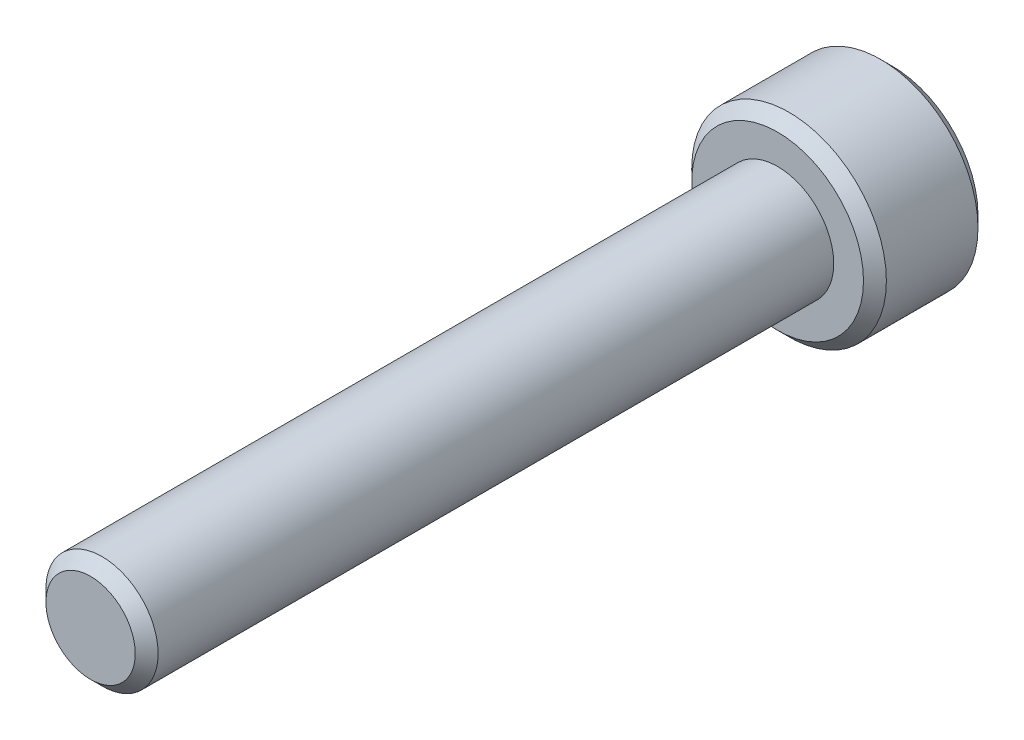
ISO-10303-21;
HEADER;
FILE_DESCRIPTION(('STEP AP214'),'2;1');
FILE_NAME('part.step','',(''),(''),'','','');
FILE_SCHEMA(('AUTOMOTIVE_DESIGN { 1 0 10303 214 1 1 1 1 }'));
ENDSEC;
DATA;
#1=APPLICATION_CONTEXT('core data for automotive mechanical design processes');
#2=APPLICATION_PROTOCOL_DEFINITION('international standard','automotive_design',2000,#1);
#3=PRODUCT_CONTEXT('',#1,'mechanical');
#4=PRODUCT('Part','Part','',(#3));
#5=PRODUCT_RELATED_PRODUCT_CATEGORY('part','',(#4));
#6=PRODUCT_DEFINITION_FORMATION('','',#4);
#7=PRODUCT_DEFINITION_CONTEXT('part definition',#1,'design');
#8=PRODUCT_DEFINITION('design','',#6,#7);
#9=PRODUCT_DEFINITION_SHAPE('','',#8);
#10=(LENGTH_UNIT() NAMED_UNIT(*) SI_UNIT(.MILLI.,.METRE.));
#11=(NAMED_UNIT(*) PLANE_ANGLE_UNIT() SI_UNIT($,.RADIAN.));
#12=(NAMED_UNIT(*) SI_UNIT($,.STERADIAN.) SOLID_ANGLE_UNIT());
#13=UNCERTAINTY_MEASURE_WITH_UNIT(LENGTH_MEASURE(1.E-05),#10,'distance_accuracy_value','');
#14=(GEOMETRIC_REPRESENTATION_CONTEXT(3) GLOBAL_UNCERTAINTY_ASSIGNED_CONTEXT((#13)) GLOBAL_UNIT_ASSIGNED_CONTEXT((#10,
#11,#12)) REPRESENTATION_CONTEXT('',''));
#15=CARTESIAN_POINT('',(0.,0.,0.));
#16=DIRECTION('',(0.,0.,1.));
#17=DIRECTION('',(1.,0.,0.));
#18=AXIS2_PLACEMENT_3D('',#15,#16,#17);
#19=CARTESIAN_POINT('',(0.,0.,5.));
#20=DIRECTION('',(0.,0.,-1.));
#21=DIRECTION('',(-1.,0.,0.));
#22=AXIS2_PLACEMENT_3D('',#19,#20,#21);
#23=CYLINDRICAL_SURFACE('',#22,4.25);
#24=CARTESIAN_POINT('',(0.,0.,0.500000000000003));
#25=DIRECTION('',(0.,0.,1.));
#26=DIRECTION('',(1.,0.,0.));
#27=AXIS2_PLACEMENT_3D('',#24,#25,#26);
#28=CIRCLE('',#27,4.25);
#29=CARTESIAN_POINT('',(4.25,0.,0.500000000000003));
#30=VERTEX_POINT('',#29);
#31=EDGE_CURVE('E64',#30,#30,#28,.T.);
#32=ORIENTED_EDGE('',*,*,#31,.T.);
#33=EDGE_LOOP('',(#32));
#34=FACE_BOUND('',#33,.T.);
#35=CARTESIAN_POINT('',(0.,0.,4.5));
#36=DIRECTION('',(0.,0.,1.));
#37=DIRECTION('',(1.,0.,0.));
#38=AXIS2_PLACEMENT_3D('',#35,#36,#37);
#39=CIRCLE('',#38,4.25);
#40=CARTESIAN_POINT('',(4.25,0.,4.5));
#41=VERTEX_POINT('',#40);
#42=EDGE_CURVE('E68',#41,#41,#39,.F.);
#43=ORIENTED_EDGE('',*,*,#42,.T.);
#44=EDGE_LOOP('',(#43));
#45=FACE_BOUND('',#44,.T.);
#46=ADVANCED_FACE('F38',(#34,#45),#23,.T.);
#47=CARTESIAN_POINT('',(0.,0.,5.));
#48=DIRECTION('',(0.,0.,1.));
#49=DIRECTION('',(1.,0.,0.));
#50=AXIS2_PLACEMENT_3D('',#47,#48,#49);
#51=PLANE('',#50);
#52=CARTESIAN_POINT('',(0.,0.,5.));
#53=DIRECTION('',(0.,0.,1.));
#54=DIRECTION('',(1.,0.,0.));
#55=AXIS2_PLACEMENT_3D('',#52,#53,#54);
#56=CIRCLE('',#55,3.75);
#57=CARTESIAN_POINT('',(3.75,0.,5.));
#58=VERTEX_POINT('',#57);
#59=EDGE_CURVE('E51',#58,#58,#56,.T.);
#60=ORIENTED_EDGE('',*,*,#59,.T.);
#61=EDGE_LOOP('',(#60));
#62=FACE_BOUND('',#61,.T.);
#63=CARTESIAN_POINT('',(0.,0.,5.));
#64=DIRECTION('',(0.,0.,1.));
#65=DIRECTION('',(1.,0.,0.));
#66=AXIS2_PLACEMENT_3D('',#63,#64,#65);
#67=CIRCLE('',#66,2.45);
#68=CARTESIAN_POINT('',(2.45,0.,5.));
#69=VERTEX_POINT('',#68);
#70=EDGE_CURVE('E71',#69,#69,#67,.F.);
#71=ORIENTED_EDGE('',*,*,#70,.T.);
#72=EDGE_LOOP('',(#71));
#73=FACE_BOUND('',#72,.T.);
#74=ADVANCED_FACE('F75',(#62,#73),#51,.T.);
#75=CARTESIAN_POINT('',(0.,0.,0.));
#76=DIRECTION('',(0.,0.,1.));
#77=DIRECTION('',(1.,0.,0.));
#78=AXIS2_PLACEMENT_3D('',#75,#76,#77);
#79=PLANE('',#78);
#80=CARTESIAN_POINT('',(0.,0.,0.));
#81=DIRECTION('',(0.,0.,1.));
#82=DIRECTION('',(1.,0.,0.));
#83=AXIS2_PLACEMENT_3D('',#80,#81,#82);
#84=CIRCLE('',#83,3.75);
#85=CARTESIAN_POINT('',(3.75,0.,0.));
#86=VERTEX_POINT('',#85);
#87=EDGE_CURVE('E58',#86,#86,#84,.F.);
#88=ORIENTED_EDGE('',*,*,#87,.T.);
#89=EDGE_LOOP('',(#88));
#90=FACE_BOUND('',#89,.T.);
#91=ADVANCED_FACE('F80',(#90),#79,.F.);
#92=CARTESIAN_POINT('',(0.,0.,35.));
#93=DIRECTION('',(0.,0.,-1.));
#94=DIRECTION('',(-1.,0.,0.));
#95=AXIS2_PLACEMENT_3D('',#92,#93,#94);
#96=CYLINDRICAL_SURFACE('',#95,2.45);
#97=CARTESIAN_POINT('',(0.,0.,34.5));
#98=DIRECTION('',(0.,0.,1.));
#99=DIRECTION('',(1.,0.,0.));
#100=AXIS2_PLACEMENT_3D('',#97,#98,#99);
#101=CIRCLE('',#100,2.45);
#102=CARTESIAN_POINT('',(2.45,0.,34.5));
#103=VERTEX_POINT('',#102);
#104=EDGE_CURVE('E10',#103,#103,#101,.F.);
#105=ORIENTED_EDGE('',*,*,#104,.T.);
#106=EDGE_LOOP('',(#105));
#107=FACE_BOUND('',#106,.T.);
#108=ORIENTED_EDGE('',*,*,#70,.F.);
#109=EDGE_LOOP('',(#108));
#110=FACE_BOUND('',#109,.T.);
#111=ADVANCED_FACE('F77',(#107,#110),#96,.T.);
#112=CARTESIAN_POINT('',(0.,0.,35.));
#113=DIRECTION('',(0.,0.,1.));
#114=DIRECTION('',(1.,0.,0.));
#115=AXIS2_PLACEMENT_3D('',#112,#113,#114);
#116=PLANE('',#115);
#117=CARTESIAN_POINT('',(0.,0.,35.));
#118=DIRECTION('',(0.,0.,1.));
#119=DIRECTION('',(1.,0.,0.));
#120=AXIS2_PLACEMENT_3D('',#117,#118,#119);
#121=CIRCLE('',#120,1.95);
#122=CARTESIAN_POINT('',(1.95,0.,35.));
#123=VERTEX_POINT('',#122);
#124=EDGE_CURVE('E46',#123,#123,#121,.T.);
#125=ORIENTED_EDGE('',*,*,#124,.T.);
#126=EDGE_LOOP('',(#125));
#127=FACE_BOUND('',#126,.T.);
#128=ADVANCED_FACE('F79',(#127),#116,.T.);
#129=CARTESIAN_POINT('',(0.,0.,0.500000000000003));
#130=DIRECTION('',(0.,0.,1.));
#131=DIRECTION('',(1.,0.,0.));
#132=AXIS2_PLACEMENT_3D('',#129,#130,#131);
#133=CONICAL_SURFACE('',#132,4.25,0.785398163397446);
#134=ORIENTED_EDGE('',*,*,#87,.F.);
#135=EDGE_LOOP('',(#134));
#136=FACE_BOUND('',#135,.T.);
#137=ORIENTED_EDGE('',*,*,#31,.F.);
#138=EDGE_LOOP('',(#137));
#139=FACE_BOUND('',#138,.T.);
#140=ADVANCED_FACE('F86',(#136,#139),#133,.T.);
#141=CARTESIAN_POINT('',(0.,0.,5.));
#142=DIRECTION('',(0.,0.,-1.));
#143=DIRECTION('',(-1.,0.,0.));
#144=AXIS2_PLACEMENT_3D('',#141,#142,#143);
#145=CONICAL_SURFACE('',#144,3.75,0.785398163397447);
#146=ORIENTED_EDGE('',*,*,#42,.F.);
#147=EDGE_LOOP('',(#146));
#148=FACE_BOUND('',#147,.T.);
#149=ORIENTED_EDGE('',*,*,#59,.F.);
#150=EDGE_LOOP('',(#149));
#151=FACE_BOUND('',#150,.T.);
#152=ADVANCED_FACE('F105',(#148,#151),#145,.T.);
#153=CARTESIAN_POINT('',(0.,0.,35.));
#154=DIRECTION('',(0.,0.,-1.));
#155=DIRECTION('',(-1.,0.,0.));
#156=AXIS2_PLACEMENT_3D('',#153,#154,#155);
#157=CONICAL_SURFACE('',#156,1.95,0.785398163397448);
#158=ORIENTED_EDGE('',*,*,#104,.F.);
#159=EDGE_LOOP('',(#158));
#160=FACE_BOUND('',#159,.T.);
#161=ORIENTED_EDGE('',*,*,#124,.F.);
#162=EDGE_LOOP('',(#161));
#163=FACE_BOUND('',#162,.T.);
#164=ADVANCED_FACE('F41',(#160,#163),#157,.T.);
#165=CLOSED_SHELL('',(#46,#74,#91,#111,#128,#140,#152,#164));
#166=MANIFOLD_SOLID_BREP('B2',#165);
#167=ADVANCED_BREP_SHAPE_REPRESENTATION('',(#18,#166),#14);
#168=SHAPE_DEFINITION_REPRESENTATION(#9,#167);
ENDSEC;
END-ISO-10303-21;
